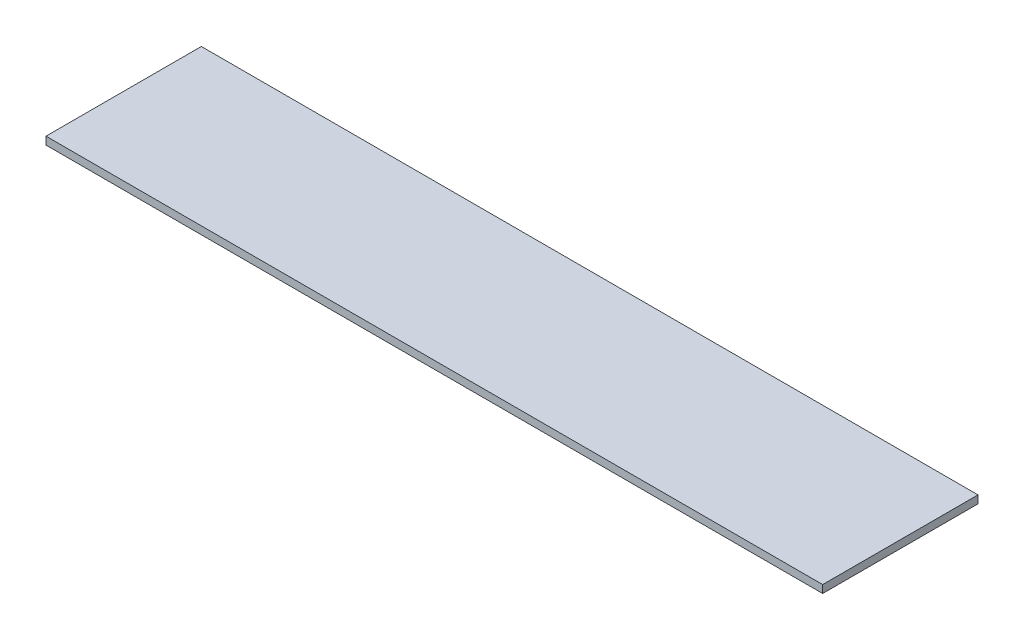
ISO-10303-21;
HEADER;
FILE_DESCRIPTION(('STEP AP214'),'2;1');
FILE_NAME('part.step','',(''),(''),'','','');
FILE_SCHEMA(('AUTOMOTIVE_DESIGN { 1 0 10303 214 1 1 1 1 }'));
ENDSEC;
DATA;
#1=APPLICATION_CONTEXT('core data for automotive mechanical design processes');
#2=APPLICATION_PROTOCOL_DEFINITION('international standard','automotive_design',2000,#1);
#3=PRODUCT_CONTEXT('',#1,'mechanical');
#4=PRODUCT('Part','Part','',(#3));
#5=PRODUCT_RELATED_PRODUCT_CATEGORY('part','',(#4));
#6=PRODUCT_DEFINITION_FORMATION('','',#4);
#7=PRODUCT_DEFINITION_CONTEXT('part definition',#1,'design');
#8=PRODUCT_DEFINITION('design','',#6,#7);
#9=PRODUCT_DEFINITION_SHAPE('','',#8);
#10=(LENGTH_UNIT() NAMED_UNIT(*) SI_UNIT(.MILLI.,.METRE.));
#11=(NAMED_UNIT(*) PLANE_ANGLE_UNIT() SI_UNIT($,.RADIAN.));
#12=(NAMED_UNIT(*) SI_UNIT($,.STERADIAN.) SOLID_ANGLE_UNIT());
#13=UNCERTAINTY_MEASURE_WITH_UNIT(LENGTH_MEASURE(1.E-05),#10,'distance_accuracy_value','');
#14=(GEOMETRIC_REPRESENTATION_CONTEXT(3) GLOBAL_UNCERTAINTY_ASSIGNED_CONTEXT((#13)) GLOBAL_UNIT_ASSIGNED_CONTEXT((#10,
#11,#12)) REPRESENTATION_CONTEXT('',''));
#15=CARTESIAN_POINT('',(0.,0.,0.));
#16=DIRECTION('',(0.,0.,1.));
#17=DIRECTION('',(1.,0.,0.));
#18=AXIS2_PLACEMENT_3D('',#15,#16,#17);
#19=CARTESIAN_POINT('',(99.9999999999999,2.,20.));
#20=DIRECTION('',(-1.,0.,0.));
#21=DIRECTION('',(0.,0.,1.));
#22=AXIS2_PLACEMENT_3D('',#19,#20,#21);
#23=PLANE('',#22);
#24=DIRECTION('',(0.,0.,-1.));
#25=VECTOR('',#24,1.);
#26=CARTESIAN_POINT('',(99.9999999999999,0.,20.));
#27=LINE('',#26,#25);
#28=CARTESIAN_POINT('',(99.9999999999999,0.,20.));
#29=VERTEX_POINT('',#28);
#30=CARTESIAN_POINT('',(99.9999999999999,0.,-20.));
#31=VERTEX_POINT('',#30);
#32=EDGE_CURVE('E100',#29,#31,#27,.T.);
#33=ORIENTED_EDGE('',*,*,#32,.T.);
#34=DIRECTION('',(0.,-1.,0.));
#35=VECTOR('',#34,1.);
#36=CARTESIAN_POINT('',(99.9999999999999,2.,-20.));
#37=LINE('',#36,#35);
#38=CARTESIAN_POINT('',(99.9999999999999,2.,-20.));
#39=VERTEX_POINT('',#38);
#40=EDGE_CURVE('E11',#39,#31,#37,.T.);
#41=ORIENTED_EDGE('',*,*,#40,.F.);
#42=DIRECTION('',(0.,0.,-1.));
#43=VECTOR('',#42,1.);
#44=CARTESIAN_POINT('',(99.9999999999999,2.,20.));
#45=LINE('',#44,#43);
#46=CARTESIAN_POINT('',(99.9999999999999,2.,20.));
#47=VERTEX_POINT('',#46);
#48=EDGE_CURVE('E88',#47,#39,#45,.T.);
#49=ORIENTED_EDGE('',*,*,#48,.F.);
#50=DIRECTION('',(0.,-1.,0.));
#51=VECTOR('',#50,1.);
#52=CARTESIAN_POINT('',(99.9999999999999,2.,20.));
#53=LINE('',#52,#51);
#54=EDGE_CURVE('E96',#47,#29,#53,.T.);
#55=ORIENTED_EDGE('',*,*,#54,.T.);
#56=EDGE_LOOP('',(#33,#41,#49,#55));
#57=FACE_BOUND('',#56,.T.);
#58=ADVANCED_FACE('F37',(#57),#23,.F.);
#59=CARTESIAN_POINT('',(-100.,2.,-20.));
#60=DIRECTION('',(0.,0.,1.));
#61=DIRECTION('',(1.,0.,0.));
#62=AXIS2_PLACEMENT_3D('',#59,#60,#61);
#63=PLANE('',#62);
#64=DIRECTION('',(-1.,0.,0.));
#65=VECTOR('',#64,1.);
#66=CARTESIAN_POINT('',(-100.,0.,-20.));
#67=LINE('',#66,#65);
#68=CARTESIAN_POINT('',(-100.,0.,-20.));
#69=VERTEX_POINT('',#68);
#70=EDGE_CURVE('E92',#31,#69,#67,.T.);
#71=ORIENTED_EDGE('',*,*,#70,.T.);
#72=DIRECTION('',(0.,-1.,0.));
#73=VECTOR('',#72,1.);
#74=CARTESIAN_POINT('',(-100.,2.,-20.));
#75=LINE('',#74,#73);
#76=CARTESIAN_POINT('',(-100.,2.,-20.));
#77=VERTEX_POINT('',#76);
#78=EDGE_CURVE('E45',#77,#69,#75,.T.);
#79=ORIENTED_EDGE('',*,*,#78,.F.);
#80=DIRECTION('',(-1.,0.,0.));
#81=VECTOR('',#80,1.);
#82=CARTESIAN_POINT('',(-100.,2.,-20.));
#83=LINE('',#82,#81);
#84=EDGE_CURVE('E83',#39,#77,#83,.T.);
#85=ORIENTED_EDGE('',*,*,#84,.F.);
#86=ORIENTED_EDGE('',*,*,#40,.T.);
#87=EDGE_LOOP('',(#71,#79,#85,#86));
#88=FACE_BOUND('',#87,.T.);
#89=ADVANCED_FACE('F91',(#88),#63,.F.);
#90=CARTESIAN_POINT('',(-100.,2.,20.));
#91=DIRECTION('',(1.,0.,0.));
#92=DIRECTION('',(0.,0.,-1.));
#93=AXIS2_PLACEMENT_3D('',#90,#91,#92);
#94=PLANE('',#93);
#95=DIRECTION('',(0.,0.,1.));
#96=VECTOR('',#95,1.);
#97=CARTESIAN_POINT('',(-100.,0.,20.));
#98=LINE('',#97,#96);
#99=CARTESIAN_POINT('',(-100.,0.,20.));
#100=VERTEX_POINT('',#99);
#101=EDGE_CURVE('E70',#69,#100,#98,.T.);
#102=ORIENTED_EDGE('',*,*,#101,.T.);
#103=DIRECTION('',(0.,-1.,0.));
#104=VECTOR('',#103,1.);
#105=CARTESIAN_POINT('',(-100.,2.,20.));
#106=LINE('',#105,#104);
#107=CARTESIAN_POINT('',(-100.,2.,20.));
#108=VERTEX_POINT('',#107);
#109=EDGE_CURVE('E93',#108,#100,#106,.T.);
#110=ORIENTED_EDGE('',*,*,#109,.F.);
#111=DIRECTION('',(0.,0.,1.));
#112=VECTOR('',#111,1.);
#113=CARTESIAN_POINT('',(-100.,2.,20.));
#114=LINE('',#113,#112);
#115=EDGE_CURVE('E86',#77,#108,#114,.T.);
#116=ORIENTED_EDGE('',*,*,#115,.F.);
#117=ORIENTED_EDGE('',*,*,#78,.T.);
#118=EDGE_LOOP('',(#102,#110,#116,#117));
#119=FACE_BOUND('',#118,.T.);
#120=ADVANCED_FACE('F94',(#119),#94,.F.);
#121=CARTESIAN_POINT('',(-100.,2.,20.));
#122=DIRECTION('',(0.,0.,-1.));
#123=DIRECTION('',(-1.,0.,0.));
#124=AXIS2_PLACEMENT_3D('',#121,#122,#123);
#125=PLANE('',#124);
#126=DIRECTION('',(1.,0.,0.));
#127=VECTOR('',#126,1.);
#128=CARTESIAN_POINT('',(-100.,0.,20.));
#129=LINE('',#128,#127);
#130=EDGE_CURVE('E76',#100,#29,#129,.T.);
#131=ORIENTED_EDGE('',*,*,#130,.T.);
#132=ORIENTED_EDGE('',*,*,#54,.F.);
#133=DIRECTION('',(1.,0.,0.));
#134=VECTOR('',#133,1.);
#135=CARTESIAN_POINT('',(-100.,2.,20.));
#136=LINE('',#135,#134);
#137=EDGE_CURVE('E53',#108,#47,#136,.T.);
#138=ORIENTED_EDGE('',*,*,#137,.F.);
#139=ORIENTED_EDGE('',*,*,#109,.T.);
#140=EDGE_LOOP('',(#131,#132,#138,#139));
#141=FACE_BOUND('',#140,.T.);
#142=ADVANCED_FACE('F107',(#141),#125,.F.);
#143=CARTESIAN_POINT('',(0.,2.,0.));
#144=DIRECTION('',(0.,-1.,0.));
#145=DIRECTION('',(0.,0.,-1.));
#146=AXIS2_PLACEMENT_3D('',#143,#144,#145);
#147=PLANE('',#146);
#148=ORIENTED_EDGE('',*,*,#48,.T.);
#149=ORIENTED_EDGE('',*,*,#84,.T.);
#150=ORIENTED_EDGE('',*,*,#115,.T.);
#151=ORIENTED_EDGE('',*,*,#137,.T.);
#152=EDGE_LOOP('',(#148,#149,#150,#151));
#153=FACE_BOUND('',#152,.T.);
#154=ADVANCED_FACE('F84',(#153),#147,.F.);
#155=CARTESIAN_POINT('',(0.,0.,0.));
#156=DIRECTION('',(0.,-1.,0.));
#157=DIRECTION('',(0.,0.,-1.));
#158=AXIS2_PLACEMENT_3D('',#155,#156,#157);
#159=PLANE('',#158);
#160=ORIENTED_EDGE('',*,*,#32,.F.);
#161=ORIENTED_EDGE('',*,*,#130,.F.);
#162=ORIENTED_EDGE('',*,*,#101,.F.);
#163=ORIENTED_EDGE('',*,*,#70,.F.);
#164=EDGE_LOOP('',(#160,#161,#162,#163));
#165=FACE_BOUND('',#164,.T.);
#166=ADVANCED_FACE('F110',(#165),#159,.T.);
#167=CLOSED_SHELL('',(#58,#89,#120,#142,#154,#166));
#168=MANIFOLD_SOLID_BREP('B2',#167);
#169=ADVANCED_BREP_SHAPE_REPRESENTATION('',(#18,#168),#14);
#170=SHAPE_DEFINITION_REPRESENTATION(#9,#169);
ENDSEC;
END-ISO-10303-21;
